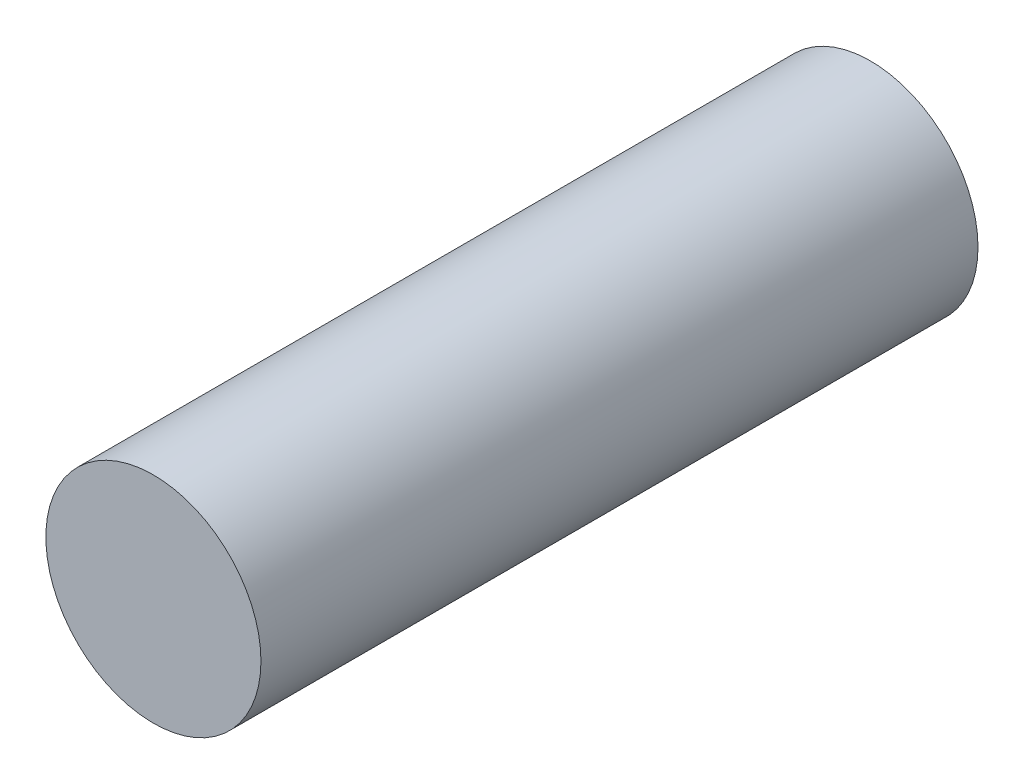
ISO-10303-21;
HEADER;
FILE_DESCRIPTION(('STEP AP214'),'2;1');
FILE_NAME('part.step','',(''),(''),'','','');
FILE_SCHEMA(('AUTOMOTIVE_DESIGN { 1 0 10303 214 1 1 1 1 }'));
ENDSEC;
DATA;
#1=APPLICATION_CONTEXT('core data for automotive mechanical design processes');
#2=APPLICATION_PROTOCOL_DEFINITION('international standard','automotive_design',2000,#1);
#3=PRODUCT_CONTEXT('',#1,'mechanical');
#4=PRODUCT('Part','Part','',(#3));
#5=PRODUCT_RELATED_PRODUCT_CATEGORY('part','',(#4));
#6=PRODUCT_DEFINITION_FORMATION('','',#4);
#7=PRODUCT_DEFINITION_CONTEXT('part definition',#1,'design');
#8=PRODUCT_DEFINITION('design','',#6,#7);
#9=PRODUCT_DEFINITION_SHAPE('','',#8);
#10=(LENGTH_UNIT() NAMED_UNIT(*) SI_UNIT(.MILLI.,.METRE.));
#11=(NAMED_UNIT(*) PLANE_ANGLE_UNIT() SI_UNIT($,.RADIAN.));
#12=(NAMED_UNIT(*) SI_UNIT($,.STERADIAN.) SOLID_ANGLE_UNIT());
#13=UNCERTAINTY_MEASURE_WITH_UNIT(LENGTH_MEASURE(1.E-05),#10,'distance_accuracy_value','');
#14=(GEOMETRIC_REPRESENTATION_CONTEXT(3) GLOBAL_UNCERTAINTY_ASSIGNED_CONTEXT((#13)) GLOBAL_UNIT_ASSIGNED_CONTEXT((#10,
#11,#12)) REPRESENTATION_CONTEXT('',''));
#15=CARTESIAN_POINT('',(0.,0.,0.));
#16=DIRECTION('',(0.,0.,1.));
#17=DIRECTION('',(1.,0.,0.));
#18=AXIS2_PLACEMENT_3D('',#15,#16,#17);
#19=CARTESIAN_POINT('',(0.,0.,60.));
#20=DIRECTION('',(0.,0.,-1.));
#21=DIRECTION('',(-1.,0.,0.));
#22=AXIS2_PLACEMENT_3D('',#19,#20,#21);
#23=CYLINDRICAL_SURFACE('',#22,9.);
#24=CARTESIAN_POINT('',(0.,0.,60.));
#25=DIRECTION('',(0.,0.,1.));
#26=DIRECTION('',(1.,0.,0.));
#27=AXIS2_PLACEMENT_3D('',#24,#25,#26);
#28=CIRCLE('',#27,9.);
#29=CARTESIAN_POINT('',(9.,0.,60.));
#30=VERTEX_POINT('',#29);
#31=EDGE_CURVE('E10',#30,#30,#28,.T.);
#32=ORIENTED_EDGE('',*,*,#31,.F.);
#33=EDGE_LOOP('',(#32));
#34=FACE_BOUND('',#33,.T.);
#35=CARTESIAN_POINT('',(0.,0.,0.));
#36=DIRECTION('',(0.,0.,1.));
#37=DIRECTION('',(1.,0.,0.));
#38=AXIS2_PLACEMENT_3D('',#35,#36,#37);
#39=CIRCLE('',#38,9.);
#40=CARTESIAN_POINT('',(9.,0.,0.));
#41=VERTEX_POINT('',#40);
#42=EDGE_CURVE('E32',#41,#41,#39,.T.);
#43=ORIENTED_EDGE('',*,*,#42,.T.);
#44=EDGE_LOOP('',(#43));
#45=FACE_BOUND('',#44,.T.);
#46=ADVANCED_FACE('F29',(#34,#45),#23,.T.);
#47=CARTESIAN_POINT('',(0.,0.,60.));
#48=DIRECTION('',(0.,0.,1.));
#49=DIRECTION('',(1.,0.,0.));
#50=AXIS2_PLACEMENT_3D('',#47,#48,#49);
#51=PLANE('',#50);
#52=ORIENTED_EDGE('',*,*,#31,.T.);
#53=EDGE_LOOP('',(#52));
#54=FACE_BOUND('',#53,.T.);
#55=ADVANCED_FACE('F44',(#54),#51,.T.);
#56=CARTESIAN_POINT('',(0.,0.,0.));
#57=DIRECTION('',(0.,0.,1.));
#58=DIRECTION('',(1.,0.,0.));
#59=AXIS2_PLACEMENT_3D('',#56,#57,#58);
#60=PLANE('',#59);
#61=ORIENTED_EDGE('',*,*,#42,.F.);
#62=EDGE_LOOP('',(#61));
#63=FACE_BOUND('',#62,.T.);
#64=ADVANCED_FACE('F42',(#63),#60,.F.);
#65=CLOSED_SHELL('',(#46,#55,#64));
#66=MANIFOLD_SOLID_BREP('B2',#65);
#67=ADVANCED_BREP_SHAPE_REPRESENTATION('',(#18,#66),#14);
#68=SHAPE_DEFINITION_REPRESENTATION(#9,#67);
ENDSEC;
END-ISO-10303-21;
